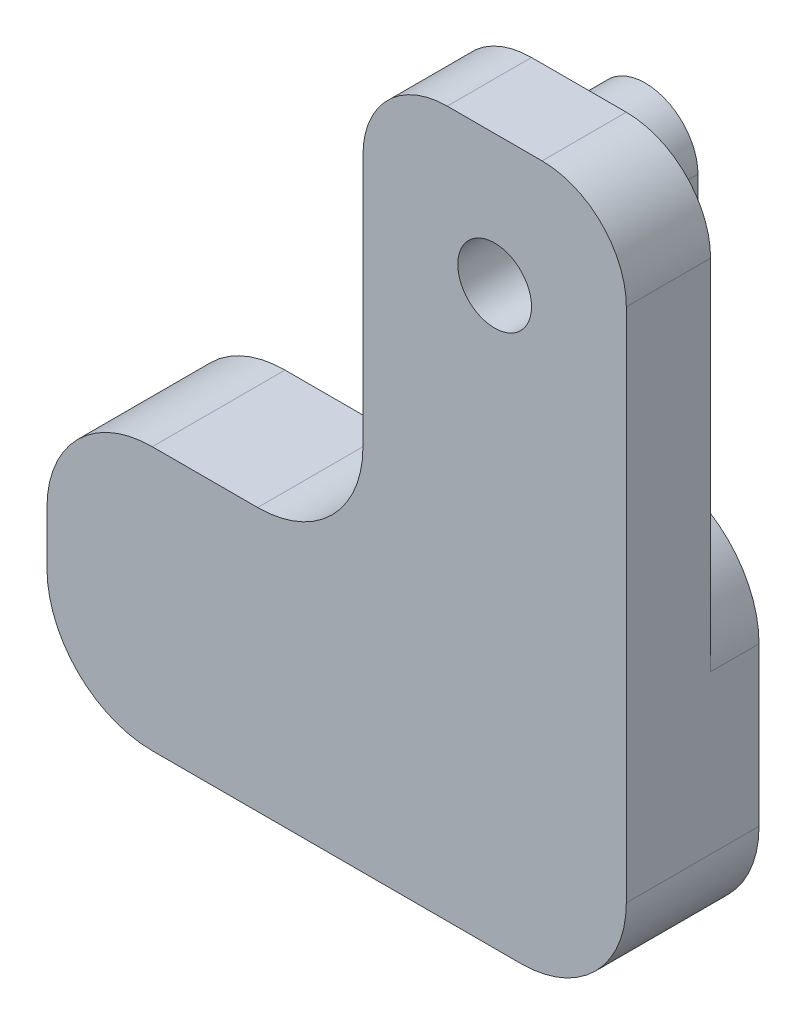
ISO-10303-21;
HEADER;
FILE_DESCRIPTION(('STEP AP214'),'2;1');
FILE_NAME('part.step','',(''),(''),'','','');
FILE_SCHEMA(('AUTOMOTIVE_DESIGN { 1 0 10303 214 1 1 1 1 }'));
ENDSEC;
DATA;
#1=APPLICATION_CONTEXT('core data for automotive mechanical design processes');
#2=APPLICATION_PROTOCOL_DEFINITION('international standard','automotive_design',2000,#1);
#3=PRODUCT_CONTEXT('',#1,'mechanical');
#4=PRODUCT('Part','Part','',(#3));
#5=PRODUCT_RELATED_PRODUCT_CATEGORY('part','',(#4));
#6=PRODUCT_DEFINITION_FORMATION('','',#4);
#7=PRODUCT_DEFINITION_CONTEXT('part definition',#1,'design');
#8=PRODUCT_DEFINITION('design','',#6,#7);
#9=PRODUCT_DEFINITION_SHAPE('','',#8);
#10=(LENGTH_UNIT() NAMED_UNIT(*) SI_UNIT(.MILLI.,.METRE.));
#11=(NAMED_UNIT(*) PLANE_ANGLE_UNIT() SI_UNIT($,.RADIAN.));
#12=(NAMED_UNIT(*) SI_UNIT($,.STERADIAN.) SOLID_ANGLE_UNIT());
#13=UNCERTAINTY_MEASURE_WITH_UNIT(LENGTH_MEASURE(1.E-05),#10,'distance_accuracy_value','');
#14=(GEOMETRIC_REPRESENTATION_CONTEXT(3) GLOBAL_UNCERTAINTY_ASSIGNED_CONTEXT((#13)) GLOBAL_UNIT_ASSIGNED_CONTEXT((#10,
#11,#12)) REPRESENTATION_CONTEXT('',''));
#15=CARTESIAN_POINT('',(0.,0.,0.));
#16=DIRECTION('',(0.,0.,1.));
#17=DIRECTION('',(1.,0.,0.));
#18=AXIS2_PLACEMENT_3D('',#15,#16,#17);
#19=CARTESIAN_POINT('',(-4.5,4.5,6.3));
#20=DIRECTION('',(0.,0.,1.));
#21=DIRECTION('',(1.,0.,0.));
#22=AXIS2_PLACEMENT_3D('',#19,#20,#21);
#23=PLANE('',#22);
#24=DIRECTION('',(0.,-1.,0.));
#25=VECTOR('',#24,1.);
#26=CARTESIAN_POINT('',(5.,4.5,6.3));
#27=LINE('',#26,#25);
#28=CARTESIAN_POINT('',(5.,4.5,6.3));
#29=VERTEX_POINT('',#28);
#30=CARTESIAN_POINT('',(5.,-4.5,6.3));
#31=VERTEX_POINT('',#30);
#32=EDGE_CURVE('E335',#29,#31,#27,.T.);
#33=ORIENTED_EDGE('',*,*,#32,.F.);
#34=CARTESIAN_POINT('',(0.,4.5,6.3));
#35=DIRECTION('',(0.,0.,1.));
#36=DIRECTION('',(1.,0.,0.));
#37=AXIS2_PLACEMENT_3D('',#34,#35,#36);
#38=CIRCLE('',#37,5.);
#39=CARTESIAN_POINT('',(-5.,4.5,6.3));
#40=VERTEX_POINT('',#39);
#41=EDGE_CURVE('E325',#29,#40,#38,.T.);
#42=ORIENTED_EDGE('',*,*,#41,.T.);
#43=DIRECTION('',(0.,-1.,0.));
#44=VECTOR('',#43,1.);
#45=CARTESIAN_POINT('',(-5.,4.5,6.3));
#46=LINE('',#45,#44);
#47=CARTESIAN_POINT('',(-5.,-4.5,6.3));
#48=VERTEX_POINT('',#47);
#49=EDGE_CURVE('E328',#40,#48,#46,.T.);
#50=ORIENTED_EDGE('',*,*,#49,.T.);
#51=CARTESIAN_POINT('',(0.,-4.5,6.3));
#52=DIRECTION('',(0.,0.,1.));
#53=DIRECTION('',(1.,0.,0.));
#54=AXIS2_PLACEMENT_3D('',#51,#52,#53);
#55=CIRCLE('',#54,5.);
#56=EDGE_CURVE('E332',#48,#31,#55,.T.);
#57=ORIENTED_EDGE('',*,*,#56,.T.);
#58=EDGE_LOOP('',(#33,#42,#50,#57));
#59=FACE_BOUND('',#58,.T.);
#60=CARTESIAN_POINT('',(-5.17949192431123,-29.5,6.3));
#61=DIRECTION('',(0.,0.,-1.));
#62=DIRECTION('',(1.,0.,0.));
#63=AXIS2_PLACEMENT_3D('',#60,#61,#62);
#64=CIRCLE('',#63,10.);
#65=CARTESIAN_POINT('',(-13.8397459621556,-24.5,6.3));
#66=VERTEX_POINT('',#65);
#67=CARTESIAN_POINT('',(-5.17949192431123,-19.5,6.3));
#68=VERTEX_POINT('',#67);
#69=EDGE_CURVE('E235',#66,#68,#64,.T.);
#70=ORIENTED_EDGE('',*,*,#69,.F.);
#71=CARTESIAN_POINT('',(-22.5,-19.5,6.3));
#72=DIRECTION('',(0.,0.,1.));
#73=DIRECTION('',(1.,0.,0.));
#74=AXIS2_PLACEMENT_3D('',#71,#72,#73);
#75=CIRCLE('',#74,10.);
#76=CARTESIAN_POINT('',(-12.5,-19.5,6.3));
#77=VERTEX_POINT('',#76);
#78=EDGE_CURVE('E11',#66,#77,#75,.T.);
#79=ORIENTED_EDGE('',*,*,#78,.T.);
#80=DIRECTION('',(0.,-1.,0.));
#81=VECTOR('',#80,1.);
#82=CARTESIAN_POINT('',(-12.5,4.5,6.3));
#83=LINE('',#82,#81);
#84=CARTESIAN_POINT('',(-12.5,4.5,6.3));
#85=VERTEX_POINT('',#84);
#86=EDGE_CURVE('E297',#85,#77,#83,.T.);
#87=ORIENTED_EDGE('',*,*,#86,.F.);
#88=CARTESIAN_POINT('',(-4.5,4.5,6.3));
#89=DIRECTION('',(0.,0.,1.));
#90=DIRECTION('',(1.,0.,0.));
#91=AXIS2_PLACEMENT_3D('',#88,#89,#90);
#92=CIRCLE('',#91,8.);
#93=CARTESIAN_POINT('',(-4.5,12.5,6.3));
#94=VERTEX_POINT('',#93);
#95=EDGE_CURVE('E271',#94,#85,#92,.T.);
#96=ORIENTED_EDGE('',*,*,#95,.F.);
#97=DIRECTION('',(-1.,0.,0.));
#98=VECTOR('',#97,1.);
#99=CARTESIAN_POINT('',(-4.5,12.5,6.3));
#100=LINE('',#99,#98);
#101=CARTESIAN_POINT('',(4.5,12.5,6.3));
#102=VERTEX_POINT('',#101);
#103=EDGE_CURVE('E280',#102,#94,#100,.T.);
#104=ORIENTED_EDGE('',*,*,#103,.F.);
#105=CARTESIAN_POINT('',(4.5,4.5,6.3));
#106=DIRECTION('',(0.,0.,1.));
#107=DIRECTION('',(-1.,0.,0.));
#108=AXIS2_PLACEMENT_3D('',#105,#106,#107);
#109=CIRCLE('',#108,8.);
#110=CARTESIAN_POINT('',(12.5,4.5,6.3));
#111=VERTEX_POINT('',#110);
#112=EDGE_CURVE('E304',#111,#102,#109,.T.);
#113=ORIENTED_EDGE('',*,*,#112,.F.);
#114=DIRECTION('',(0.,1.,0.));
#115=VECTOR('',#114,1.);
#116=CARTESIAN_POINT('',(12.5,4.5,6.3));
#117=LINE('',#116,#115);
#118=CARTESIAN_POINT('',(12.5,-29.5000000000001,6.3));
#119=VERTEX_POINT('',#118);
#120=EDGE_CURVE('E301',#119,#111,#117,.T.);
#121=ORIENTED_EDGE('',*,*,#120,.F.);
#122=CARTESIAN_POINT('',(2.50000000000001,-29.5,6.3));
#123=DIRECTION('',(0.,0.,-1.));
#124=DIRECTION('',(-1.,0.,0.));
#125=AXIS2_PLACEMENT_3D('',#122,#123,#124);
#126=CIRCLE('',#125,10.);
#127=CARTESIAN_POINT('',(2.49999999999994,-19.5,6.3));
#128=VERTEX_POINT('',#127);
#129=EDGE_CURVE('E59',#128,#119,#126,.T.);
#130=ORIENTED_EDGE('',*,*,#129,.F.);
#131=DIRECTION('',(1.,0.,0.));
#132=VECTOR('',#131,1.);
#133=CARTESIAN_POINT('',(2.49999999999994,-19.5,6.3));
#134=LINE('',#133,#132);
#135=EDGE_CURVE('E54',#68,#128,#134,.T.);
#136=ORIENTED_EDGE('',*,*,#135,.F.);
#137=EDGE_LOOP('',(#70,#79,#87,#96,#104,#113,#121,#130,#136));
#138=FACE_BOUND('',#137,.T.);
#139=ADVANCED_FACE('F38',(#59,#138),#23,.F.);
#140=CARTESIAN_POINT('',(0.,4.5,6.3));
#141=DIRECTION('',(0.,0.,-1.));
#142=DIRECTION('',(-1.,0.,0.));
#143=AXIS2_PLACEMENT_3D('',#140,#141,#142);
#144=CYLINDRICAL_SURFACE('',#143,5.);
#145=CARTESIAN_POINT('',(0.,4.5,0.));
#146=DIRECTION('',(0.,0.,1.));
#147=DIRECTION('',(1.,0.,0.));
#148=AXIS2_PLACEMENT_3D('',#145,#146,#147);
#149=CIRCLE('',#148,5.);
#150=CARTESIAN_POINT('',(5.,4.5,0.));
#151=VERTEX_POINT('',#150);
#152=CARTESIAN_POINT('',(-5.,4.5,0.));
#153=VERTEX_POINT('',#152);
#154=EDGE_CURVE('E324',#151,#153,#149,.T.);
#155=ORIENTED_EDGE('',*,*,#154,.T.);
#156=DIRECTION('',(0.,0.,-1.));
#157=VECTOR('',#156,1.);
#158=CARTESIAN_POINT('',(-5.,4.5,6.3));
#159=LINE('',#158,#157);
#160=EDGE_CURVE('E362',#40,#153,#159,.T.);
#161=ORIENTED_EDGE('',*,*,#160,.F.);
#162=ORIENTED_EDGE('',*,*,#41,.F.);
#163=DIRECTION('',(0.,0.,-1.));
#164=VECTOR('',#163,1.);
#165=CARTESIAN_POINT('',(5.,4.5,6.3));
#166=LINE('',#165,#164);
#167=EDGE_CURVE('E339',#29,#151,#166,.T.);
#168=ORIENTED_EDGE('',*,*,#167,.T.);
#169=EDGE_LOOP('',(#155,#161,#162,#168));
#170=FACE_BOUND('',#169,.T.);
#171=ADVANCED_FACE('F460',(#170),#144,.T.);
#172=CARTESIAN_POINT('',(-5.,4.5,6.3));
#173=DIRECTION('',(1.,0.,0.));
#174=DIRECTION('',(0.,0.,-1.));
#175=AXIS2_PLACEMENT_3D('',#172,#173,#174);
#176=PLANE('',#175);
#177=DIRECTION('',(0.,-1.,0.));
#178=VECTOR('',#177,1.);
#179=CARTESIAN_POINT('',(-5.,4.5,0.));
#180=LINE('',#179,#178);
#181=CARTESIAN_POINT('',(-5.,-4.5,0.));
#182=VERTEX_POINT('',#181);
#183=EDGE_CURVE('E343',#153,#182,#180,.T.);
#184=ORIENTED_EDGE('',*,*,#183,.T.);
#185=DIRECTION('',(0.,0.,-1.));
#186=VECTOR('',#185,1.);
#187=CARTESIAN_POINT('',(-5.,-4.5,6.3));
#188=LINE('',#187,#186);
#189=EDGE_CURVE('E358',#48,#182,#188,.T.);
#190=ORIENTED_EDGE('',*,*,#189,.F.);
#191=ORIENTED_EDGE('',*,*,#49,.F.);
#192=ORIENTED_EDGE('',*,*,#160,.T.);
#193=EDGE_LOOP('',(#184,#190,#191,#192));
#194=FACE_BOUND('',#193,.T.);
#195=ADVANCED_FACE('F466',(#194),#176,.F.);
#196=CARTESIAN_POINT('',(0.,-4.5,6.3));
#197=DIRECTION('',(0.,0.,-1.));
#198=DIRECTION('',(-1.,0.,0.));
#199=AXIS2_PLACEMENT_3D('',#196,#197,#198);
#200=CYLINDRICAL_SURFACE('',#199,5.);
#201=CARTESIAN_POINT('',(0.,-4.5,0.));
#202=DIRECTION('',(0.,0.,1.));
#203=DIRECTION('',(1.,0.,0.));
#204=AXIS2_PLACEMENT_3D('',#201,#202,#203);
#205=CIRCLE('',#204,5.);
#206=CARTESIAN_POINT('',(5.,-4.5,0.));
#207=VERTEX_POINT('',#206);
#208=EDGE_CURVE('E346',#182,#207,#205,.T.);
#209=ORIENTED_EDGE('',*,*,#208,.T.);
#210=DIRECTION('',(0.,0.,-1.));
#211=VECTOR('',#210,1.);
#212=CARTESIAN_POINT('',(5.,-4.5,6.3));
#213=LINE('',#212,#211);
#214=EDGE_CURVE('E355',#31,#207,#213,.T.);
#215=ORIENTED_EDGE('',*,*,#214,.F.);
#216=ORIENTED_EDGE('',*,*,#56,.F.);
#217=ORIENTED_EDGE('',*,*,#189,.T.);
#218=EDGE_LOOP('',(#209,#215,#216,#217));
#219=FACE_BOUND('',#218,.T.);
#220=ADVANCED_FACE('F489',(#219),#200,.T.);
#221=CARTESIAN_POINT('',(5.,4.5,6.3));
#222=DIRECTION('',(1.,0.,0.));
#223=DIRECTION('',(0.,0.,-1.));
#224=AXIS2_PLACEMENT_3D('',#221,#222,#223);
#225=PLANE('',#224);
#226=DIRECTION('',(0.,-1.,0.));
#227=VECTOR('',#226,1.);
#228=CARTESIAN_POINT('',(5.,4.5,0.));
#229=LINE('',#228,#227);
#230=EDGE_CURVE('E329',#151,#207,#229,.T.);
#231=ORIENTED_EDGE('',*,*,#230,.F.);
#232=ORIENTED_EDGE('',*,*,#167,.F.);
#233=ORIENTED_EDGE('',*,*,#32,.T.);
#234=ORIENTED_EDGE('',*,*,#214,.T.);
#235=EDGE_LOOP('',(#231,#232,#233,#234));
#236=FACE_BOUND('',#235,.T.);
#237=ADVANCED_FACE('F485',(#236),#225,.T.);
#238=CARTESIAN_POINT('',(0.,4.5,0.));
#239=DIRECTION('',(0.,0.,1.));
#240=DIRECTION('',(1.,0.,0.));
#241=AXIS2_PLACEMENT_3D('',#238,#239,#240);
#242=PLANE('',#241);
#243=ORIENTED_EDGE('',*,*,#154,.F.);
#244=ORIENTED_EDGE('',*,*,#230,.T.);
#245=ORIENTED_EDGE('',*,*,#208,.F.);
#246=ORIENTED_EDGE('',*,*,#183,.F.);
#247=EDGE_LOOP('',(#243,#244,#245,#246));
#248=FACE_BOUND('',#247,.T.);
#249=ADVANCED_FACE('F482',(#248),#242,.F.);
#250=CARTESIAN_POINT('',(-4.5,4.5,14.3));
#251=DIRECTION('',(0.,0.,-1.));
#252=DIRECTION('',(-1.,0.,0.));
#253=AXIS2_PLACEMENT_3D('',#250,#251,#252);
#254=CYLINDRICAL_SURFACE('',#253,8.);
#255=ORIENTED_EDGE('',*,*,#95,.T.);
#256=DIRECTION('',(0.,0.,-1.));
#257=VECTOR('',#256,1.);
#258=CARTESIAN_POINT('',(-12.5,4.5,14.3));
#259=LINE('',#258,#257);
#260=CARTESIAN_POINT('',(-12.5,4.5,14.3));
#261=VERTEX_POINT('',#260);
#262=EDGE_CURVE('E320',#261,#85,#259,.T.);
#263=ORIENTED_EDGE('',*,*,#262,.F.);
#264=CARTESIAN_POINT('',(-4.5,4.5,14.3));
#265=DIRECTION('',(0.,0.,1.));
#266=DIRECTION('',(1.,0.,0.));
#267=AXIS2_PLACEMENT_3D('',#264,#265,#266);
#268=CIRCLE('',#267,8.);
#269=CARTESIAN_POINT('',(-4.5,12.5,14.3));
#270=VERTEX_POINT('',#269);
#271=EDGE_CURVE('E275',#270,#261,#268,.T.);
#272=ORIENTED_EDGE('',*,*,#271,.F.);
#273=DIRECTION('',(0.,0.,-1.));
#274=VECTOR('',#273,1.);
#275=CARTESIAN_POINT('',(-4.5,12.5,14.3));
#276=LINE('',#275,#274);
#277=EDGE_CURVE('E293',#270,#94,#276,.T.);
#278=ORIENTED_EDGE('',*,*,#277,.T.);
#279=EDGE_LOOP('',(#255,#263,#272,#278));
#280=FACE_BOUND('',#279,.T.);
#281=ADVANCED_FACE('F438',(#280),#254,.T.);
#282=CARTESIAN_POINT('',(-12.5,4.5,14.3));
#283=DIRECTION('',(1.,0.,0.));
#284=DIRECTION('',(0.,0.,-1.));
#285=AXIS2_PLACEMENT_3D('',#282,#283,#284);
#286=PLANE('',#285);
#287=ORIENTED_EDGE('',*,*,#86,.T.);
#288=DIRECTION('',(0.,0.,1.));
#289=VECTOR('',#288,1.);
#290=CARTESIAN_POINT('',(-12.5,-19.5,14.3));
#291=LINE('',#290,#289);
#292=CARTESIAN_POINT('',(-12.5,-19.5,14.3));
#293=VERTEX_POINT('',#292);
#294=EDGE_CURVE('E385',#77,#293,#291,.T.);
#295=ORIENTED_EDGE('',*,*,#294,.T.);
#296=DIRECTION('',(0.,-1.,0.));
#297=VECTOR('',#296,1.);
#298=CARTESIAN_POINT('',(-12.5,4.5,14.3));
#299=LINE('',#298,#297);
#300=EDGE_CURVE('E279',#261,#293,#299,.T.);
#301=ORIENTED_EDGE('',*,*,#300,.F.);
#302=ORIENTED_EDGE('',*,*,#262,.T.);
#303=EDGE_LOOP('',(#287,#295,#301,#302));
#304=FACE_BOUND('',#303,.T.);
#305=ADVANCED_FACE('F440',(#304),#286,.F.);
#306=CARTESIAN_POINT('',(12.5,4.5,14.3));
#307=DIRECTION('',(-1.,0.,0.));
#308=DIRECTION('',(0.,-1.,0.));
#309=AXIS2_PLACEMENT_3D('',#306,#307,#308);
#310=PLANE('',#309);
#311=DIRECTION('',(0.,1.,0.));
#312=VECTOR('',#311,1.);
#313=CARTESIAN_POINT('',(12.5,4.5,14.3));
#314=LINE('',#313,#312);
#315=CARTESIAN_POINT('',(12.5,-44.5,14.3));
#316=VERTEX_POINT('',#315);
#317=CARTESIAN_POINT('',(12.5,4.5,14.3));
#318=VERTEX_POINT('',#317);
#319=EDGE_CURVE('E284',#316,#318,#314,.T.);
#320=ORIENTED_EDGE('',*,*,#319,.F.);
#321=DIRECTION('',(0.,0.,1.));
#322=VECTOR('',#321,1.);
#323=CARTESIAN_POINT('',(12.5,-44.5,6.3));
#324=LINE('',#323,#322);
#325=CARTESIAN_POINT('',(12.5,-44.5,1.7));
#326=VERTEX_POINT('',#325);
#327=EDGE_CURVE('E375',#316,#326,#324,.F.);
#328=ORIENTED_EDGE('',*,*,#327,.T.);
#329=DIRECTION('',(0.,-1.,0.));
#330=VECTOR('',#329,1.);
#331=CARTESIAN_POINT('',(12.5,-29.5000000000001,1.7));
#332=LINE('',#331,#330);
#333=CARTESIAN_POINT('',(12.5,-29.5000000000001,1.7));
#334=VERTEX_POINT('',#333);
#335=EDGE_CURVE('E200',#334,#326,#332,.T.);
#336=ORIENTED_EDGE('',*,*,#335,.F.);
#337=DIRECTION('',(0.,0.,1.));
#338=VECTOR('',#337,1.);
#339=CARTESIAN_POINT('',(12.5,-29.5000000000001,1.7));
#340=LINE('',#339,#338);
#341=EDGE_CURVE('E234',#334,#119,#340,.T.);
#342=ORIENTED_EDGE('',*,*,#341,.T.);
#343=ORIENTED_EDGE('',*,*,#120,.T.);
#344=DIRECTION('',(0.,0.,-1.));
#345=VECTOR('',#344,1.);
#346=CARTESIAN_POINT('',(12.5,4.5,14.3));
#347=LINE('',#346,#345);
#348=EDGE_CURVE('E316',#318,#111,#347,.T.);
#349=ORIENTED_EDGE('',*,*,#348,.F.);
#350=EDGE_LOOP('',(#320,#328,#336,#342,#343,#349));
#351=FACE_BOUND('',#350,.T.);
#352=ADVANCED_FACE('F423',(#351),#310,.F.);
#353=CARTESIAN_POINT('',(4.5,4.5,14.3));
#354=DIRECTION('',(0.,0.,-1.));
#355=DIRECTION('',(-1.,0.,0.));
#356=AXIS2_PLACEMENT_3D('',#353,#354,#355);
#357=CYLINDRICAL_SURFACE('',#356,8.);
#358=ORIENTED_EDGE('',*,*,#112,.T.);
#359=DIRECTION('',(0.,0.,-1.));
#360=VECTOR('',#359,1.);
#361=CARTESIAN_POINT('',(4.5,12.5,14.3));
#362=LINE('',#361,#360);
#363=CARTESIAN_POINT('',(4.5,12.5,14.3));
#364=VERTEX_POINT('',#363);
#365=EDGE_CURVE('E312',#364,#102,#362,.T.);
#366=ORIENTED_EDGE('',*,*,#365,.F.);
#367=CARTESIAN_POINT('',(4.5,4.5,14.3));
#368=DIRECTION('',(0.,0.,1.));
#369=DIRECTION('',(-1.,0.,0.));
#370=AXIS2_PLACEMENT_3D('',#367,#368,#369);
#371=CIRCLE('',#370,8.);
#372=EDGE_CURVE('E287',#318,#364,#371,.T.);
#373=ORIENTED_EDGE('',*,*,#372,.F.);
#374=ORIENTED_EDGE('',*,*,#348,.T.);
#375=EDGE_LOOP('',(#358,#366,#373,#374));
#376=FACE_BOUND('',#375,.T.);
#377=ADVANCED_FACE('F428',(#376),#357,.T.);
#378=CARTESIAN_POINT('',(-4.5,12.5,14.3));
#379=DIRECTION('',(0.,-1.,0.));
#380=DIRECTION('',(0.,0.,-1.));
#381=AXIS2_PLACEMENT_3D('',#378,#379,#380);
#382=PLANE('',#381);
#383=ORIENTED_EDGE('',*,*,#103,.T.);
#384=ORIENTED_EDGE('',*,*,#277,.F.);
#385=DIRECTION('',(-1.,0.,0.));
#386=VECTOR('',#385,1.);
#387=CARTESIAN_POINT('',(-4.5,12.5,14.3));
#388=LINE('',#387,#386);
#389=EDGE_CURVE('E290',#364,#270,#388,.T.);
#390=ORIENTED_EDGE('',*,*,#389,.F.);
#391=ORIENTED_EDGE('',*,*,#365,.T.);
#392=EDGE_LOOP('',(#383,#384,#390,#391));
#393=FACE_BOUND('',#392,.T.);
#394=ADVANCED_FACE('F434',(#393),#382,.F.);
#395=CARTESIAN_POINT('',(-4.5,4.5,14.3));
#396=DIRECTION('',(0.,0.,1.));
#397=DIRECTION('',(1.,0.,0.));
#398=AXIS2_PLACEMENT_3D('',#395,#396,#397);
#399=PLANE('',#398);
#400=CARTESIAN_POINT('',(0.,0.,14.3));
#401=DIRECTION('',(0.,0.,1.));
#402=DIRECTION('',(1.,0.,0.));
#403=AXIS2_PLACEMENT_3D('',#400,#401,#402);
#404=CIRCLE('',#403,3.5);
#405=CARTESIAN_POINT('',(3.5,0.,14.3));
#406=VERTEX_POINT('',#405);
#407=EDGE_CURVE('E266',#406,#406,#404,.T.);
#408=ORIENTED_EDGE('',*,*,#407,.F.);
#409=EDGE_LOOP('',(#408));
#410=FACE_BOUND('',#409,.T.);
#411=DIRECTION('',(1.,0.,0.));
#412=VECTOR('',#411,1.);
#413=CARTESIAN_POINT('',(-12.5,-54.5,14.3));
#414=LINE('',#413,#412);
#415=CARTESIAN_POINT('',(-32.5,-54.5,14.3));
#416=VERTEX_POINT('',#415);
#417=CARTESIAN_POINT('',(2.50000000000002,-54.5,14.3));
#418=VERTEX_POINT('',#417);
#419=EDGE_CURVE('E263',#416,#418,#414,.T.);
#420=ORIENTED_EDGE('',*,*,#419,.T.);
#421=CARTESIAN_POINT('',(2.50000000000002,-44.5,14.3));
#422=DIRECTION('',(0.,0.,1.));
#423=DIRECTION('',(1.,0.,0.));
#424=AXIS2_PLACEMENT_3D('',#421,#422,#423);
#425=CIRCLE('',#424,10.);
#426=EDGE_CURVE('E179',#418,#316,#425,.T.);
#427=ORIENTED_EDGE('',*,*,#426,.T.);
#428=ORIENTED_EDGE('',*,*,#319,.T.);
#429=ORIENTED_EDGE('',*,*,#372,.T.);
#430=ORIENTED_EDGE('',*,*,#389,.T.);
#431=ORIENTED_EDGE('',*,*,#271,.T.);
#432=ORIENTED_EDGE('',*,*,#300,.T.);
#433=CARTESIAN_POINT('',(-22.5,-19.5,14.3));
#434=DIRECTION('',(0.,0.,1.));
#435=DIRECTION('',(1.,0.,0.));
#436=AXIS2_PLACEMENT_3D('',#433,#434,#435);
#437=CIRCLE('',#436,10.);
#438=CARTESIAN_POINT('',(-22.5,-29.5,14.3));
#439=VERTEX_POINT('',#438);
#440=EDGE_CURVE('E47',#293,#439,#437,.F.);
#441=ORIENTED_EDGE('',*,*,#440,.T.);
#442=DIRECTION('',(-1.,0.,0.));
#443=VECTOR('',#442,1.);
#444=CARTESIAN_POINT('',(-42.5,-29.5,14.3));
#445=LINE('',#444,#443);
#446=CARTESIAN_POINT('',(-32.5,-29.5,14.3));
#447=VERTEX_POINT('',#446);
#448=EDGE_CURVE('E255',#439,#447,#445,.T.);
#449=ORIENTED_EDGE('',*,*,#448,.T.);
#450=CARTESIAN_POINT('',(-32.5,-39.5,14.3));
#451=DIRECTION('',(0.,0.,1.));
#452=DIRECTION('',(1.,0.,0.));
#453=AXIS2_PLACEMENT_3D('',#450,#451,#452);
#454=CIRCLE('',#453,10.);
#455=CARTESIAN_POINT('',(-42.5,-39.5,14.3));
#456=VERTEX_POINT('',#455);
#457=EDGE_CURVE('E184',#447,#456,#454,.T.);
#458=ORIENTED_EDGE('',*,*,#457,.T.);
#459=DIRECTION('',(0.,-1.,0.));
#460=VECTOR('',#459,1.);
#461=CARTESIAN_POINT('',(-42.5,-54.5,14.3));
#462=LINE('',#461,#460);
#463=CARTESIAN_POINT('',(-42.5,-44.5,14.3));
#464=VERTEX_POINT('',#463);
#465=EDGE_CURVE('E259',#456,#464,#462,.T.);
#466=ORIENTED_EDGE('',*,*,#465,.T.);
#467=CARTESIAN_POINT('',(-32.5,-44.5,14.3));
#468=DIRECTION('',(0.,0.,1.));
#469=DIRECTION('',(1.,0.,0.));
#470=AXIS2_PLACEMENT_3D('',#467,#468,#469);
#471=CIRCLE('',#470,10.);
#472=EDGE_CURVE('E370',#464,#416,#471,.T.);
#473=ORIENTED_EDGE('',*,*,#472,.T.);
#474=EDGE_LOOP('',(#420,#427,#428,#429,#430,#431,#432,#441,#449,#458,#466,#473));
#475=FACE_BOUND('',#474,.T.);
#476=ADVANCED_FACE('F398',(#410,#475),#399,.T.);
#477=CARTESIAN_POINT('',(0.,0.,6.3));
#478=DIRECTION('',(0.,0.,1.));
#479=DIRECTION('',(1.,0.,0.));
#480=AXIS2_PLACEMENT_3D('',#477,#478,#479);
#481=CYLINDRICAL_SURFACE('',#480,3.5);
#482=CARTESIAN_POINT('',(0.,0.,6.3));
#483=DIRECTION('',(0.,0.,1.));
#484=DIRECTION('',(1.,0.,0.));
#485=AXIS2_PLACEMENT_3D('',#482,#483,#484);
#486=CIRCLE('',#485,3.5);
#487=CARTESIAN_POINT('',(3.5,0.,6.3));
#488=VERTEX_POINT('',#487);
#489=EDGE_CURVE('E267',#488,#488,#486,.T.);
#490=ORIENTED_EDGE('',*,*,#489,.F.);
#491=EDGE_LOOP('',(#490));
#492=FACE_BOUND('',#491,.T.);
#493=ORIENTED_EDGE('',*,*,#407,.T.);
#494=EDGE_LOOP('',(#493));
#495=FACE_BOUND('',#494,.T.);
#496=ADVANCED_FACE('F519',(#492,#495),#481,.F.);
#497=CARTESIAN_POINT('',(0.,0.,6.3));
#498=DIRECTION('',(0.,0.,1.));
#499=DIRECTION('',(1.,0.,0.));
#500=AXIS2_PLACEMENT_3D('',#497,#498,#499);
#501=PLANE('',#500);
#502=ORIENTED_EDGE('',*,*,#489,.T.);
#503=EDGE_LOOP('',(#502));
#504=FACE_BOUND('',#503,.T.);
#505=ADVANCED_FACE('F517',(#504),#501,.T.);
#506=CARTESIAN_POINT('',(-12.5,-54.5,-49.6016994374947));
#507=DIRECTION('',(0.,-1.,0.));
#508=DIRECTION('',(0.,0.,-1.));
#509=AXIS2_PLACEMENT_3D('',#506,#507,#508);
#510=PLANE('',#509);
#511=DIRECTION('',(0.,0.,1.));
#512=VECTOR('',#511,1.);
#513=CARTESIAN_POINT('',(-32.5,-54.5,-49.6016994374947));
#514=LINE('',#513,#512);
#515=CARTESIAN_POINT('',(-32.5,-54.5,1.7));
#516=VERTEX_POINT('',#515);
#517=EDGE_CURVE('E185',#416,#516,#514,.F.);
#518=ORIENTED_EDGE('',*,*,#517,.T.);
#519=DIRECTION('',(-1.,0.,0.));
#520=VECTOR('',#519,1.);
#521=CARTESIAN_POINT('',(2.50000000000002,-54.5,1.7));
#522=LINE('',#521,#520);
#523=CARTESIAN_POINT('',(2.50000000000002,-54.5,1.7));
#524=VERTEX_POINT('',#523);
#525=EDGE_CURVE('E188',#524,#516,#522,.T.);
#526=ORIENTED_EDGE('',*,*,#525,.F.);
#527=DIRECTION('',(0.,0.,1.));
#528=VECTOR('',#527,1.);
#529=CARTESIAN_POINT('',(2.50000000000002,-54.5,14.3));
#530=LINE('',#529,#528);
#531=EDGE_CURVE('E173',#524,#418,#530,.T.);
#532=ORIENTED_EDGE('',*,*,#531,.T.);
#533=ORIENTED_EDGE('',*,*,#419,.F.);
#534=EDGE_LOOP('',(#518,#526,#532,#533));
#535=FACE_BOUND('',#534,.T.);
#536=ADVANCED_FACE('F189',(#535),#510,.T.);
#537=CARTESIAN_POINT('',(-42.5,-54.5,-32.7512483795333));
#538=DIRECTION('',(-1.,0.,0.));
#539=DIRECTION('',(0.,0.,1.));
#540=AXIS2_PLACEMENT_3D('',#537,#538,#539);
#541=PLANE('',#540);
#542=DIRECTION('',(0.,0.,1.));
#543=VECTOR('',#542,1.);
#544=CARTESIAN_POINT('',(-42.5,-39.5,-32.7512483795333));
#545=LINE('',#544,#543);
#546=CARTESIAN_POINT('',(-42.5,-39.5,1.7));
#547=VERTEX_POINT('',#546);
#548=EDGE_CURVE('E378',#456,#547,#545,.F.);
#549=ORIENTED_EDGE('',*,*,#548,.T.);
#550=DIRECTION('',(0.,1.,0.));
#551=VECTOR('',#550,1.);
#552=CARTESIAN_POINT('',(-42.5,-44.5,1.7));
#553=LINE('',#552,#551);
#554=CARTESIAN_POINT('',(-42.5,-44.5,1.7));
#555=VERTEX_POINT('',#554);
#556=EDGE_CURVE('E208',#555,#547,#553,.T.);
#557=ORIENTED_EDGE('',*,*,#556,.F.);
#558=DIRECTION('',(0.,0.,1.));
#559=VECTOR('',#558,1.);
#560=CARTESIAN_POINT('',(-42.5,-44.5,-32.7512483795333));
#561=LINE('',#560,#559);
#562=EDGE_CURVE('E381',#555,#464,#561,.T.);
#563=ORIENTED_EDGE('',*,*,#562,.T.);
#564=ORIENTED_EDGE('',*,*,#465,.F.);
#565=EDGE_LOOP('',(#549,#557,#563,#564));
#566=FACE_BOUND('',#565,.T.);
#567=ADVANCED_FACE('F417',(#566),#541,.T.);
#568=CARTESIAN_POINT('',(-42.5,-29.5,-32.7512483795333));
#569=DIRECTION('',(0.,1.,0.));
#570=DIRECTION('',(-1.,0.,0.));
#571=AXIS2_PLACEMENT_3D('',#568,#569,#570);
#572=PLANE('',#571);
#573=ORIENTED_EDGE('',*,*,#448,.F.);
#574=DIRECTION('',(0.,0.,1.));
#575=VECTOR('',#574,1.);
#576=CARTESIAN_POINT('',(-22.5,-29.5,-32.7512483795333));
#577=LINE('',#576,#575);
#578=CARTESIAN_POINT('',(-22.5,-29.5,1.7));
#579=VERTEX_POINT('',#578);
#580=EDGE_CURVE('E393',#439,#579,#577,.F.);
#581=ORIENTED_EDGE('',*,*,#580,.T.);
#582=DIRECTION('',(1.,0.,0.));
#583=VECTOR('',#582,1.);
#584=CARTESIAN_POINT('',(-32.5,-29.5,1.7));
#585=LINE('',#584,#583);
#586=CARTESIAN_POINT('',(-32.5,-29.5,1.7));
#587=VERTEX_POINT('',#586);
#588=EDGE_CURVE('E216',#587,#579,#585,.T.);
#589=ORIENTED_EDGE('',*,*,#588,.F.);
#590=DIRECTION('',(0.,0.,1.));
#591=VECTOR('',#590,1.);
#592=CARTESIAN_POINT('',(-32.5,-29.5,-32.7512483795333));
#593=LINE('',#592,#591);
#594=EDGE_CURVE('E389',#587,#447,#593,.T.);
#595=ORIENTED_EDGE('',*,*,#594,.T.);
#596=EDGE_LOOP('',(#573,#581,#589,#595));
#597=FACE_BOUND('',#596,.T.);
#598=ADVANCED_FACE('F403',(#597),#572,.T.);
#599=CARTESIAN_POINT('',(2.50000000000002,-44.5,-49.6016994374947));
#600=DIRECTION('',(0.,0.,-1.));
#601=DIRECTION('',(-1.,0.,0.));
#602=AXIS2_PLACEMENT_3D('',#599,#600,#601);
#603=CYLINDRICAL_SURFACE('',#602,10.);
#604=ORIENTED_EDGE('',*,*,#531,.F.);
#605=CARTESIAN_POINT('',(2.50000000000002,-44.5,1.7));
#606=DIRECTION('',(0.,0.,-1.));
#607=DIRECTION('',(-1.,0.,0.));
#608=AXIS2_PLACEMENT_3D('',#605,#606,#607);
#609=CIRCLE('',#608,10.);
#610=EDGE_CURVE('E178',#326,#524,#609,.T.);
#611=ORIENTED_EDGE('',*,*,#610,.F.);
#612=ORIENTED_EDGE('',*,*,#327,.F.);
#613=ORIENTED_EDGE('',*,*,#426,.F.);
#614=EDGE_LOOP('',(#604,#611,#612,#613));
#615=FACE_BOUND('',#614,.T.);
#616=ADVANCED_FACE('F175',(#615),#603,.T.);
#617=CARTESIAN_POINT('',(-32.5,-44.5,-32.7512483795333));
#618=DIRECTION('',(0.,0.,1.));
#619=DIRECTION('',(1.,0.,0.));
#620=AXIS2_PLACEMENT_3D('',#617,#618,#619);
#621=CYLINDRICAL_SURFACE('',#620,10.);
#622=ORIENTED_EDGE('',*,*,#562,.F.);
#623=CARTESIAN_POINT('',(-32.5,-44.5,1.7));
#624=DIRECTION('',(0.,0.,-1.));
#625=DIRECTION('',(-1.,0.,0.));
#626=AXIS2_PLACEMENT_3D('',#623,#624,#625);
#627=CIRCLE('',#626,10.);
#628=EDGE_CURVE('E195',#516,#555,#627,.T.);
#629=ORIENTED_EDGE('',*,*,#628,.F.);
#630=ORIENTED_EDGE('',*,*,#517,.F.);
#631=ORIENTED_EDGE('',*,*,#472,.F.);
#632=EDGE_LOOP('',(#622,#629,#630,#631));
#633=FACE_BOUND('',#632,.T.);
#634=ADVANCED_FACE('F419',(#633),#621,.T.);
#635=CARTESIAN_POINT('',(-22.5,-19.5,14.3));
#636=DIRECTION('',(0.,0.,1.));
#637=DIRECTION('',(1.,0.,0.));
#638=AXIS2_PLACEMENT_3D('',#635,#636,#637);
#639=CYLINDRICAL_SURFACE('',#638,10.);
#640=ORIENTED_EDGE('',*,*,#78,.F.);
#641=DIRECTION('',(0.,0.,1.));
#642=VECTOR('',#641,1.);
#643=CARTESIAN_POINT('',(-13.8397459621556,-24.5,1.7));
#644=LINE('',#643,#642);
#645=CARTESIAN_POINT('',(-13.8397459621556,-24.5,1.7));
#646=VERTEX_POINT('',#645);
#647=EDGE_CURVE('E251',#646,#66,#644,.T.);
#648=ORIENTED_EDGE('',*,*,#647,.F.);
#649=CARTESIAN_POINT('',(-22.5,-19.5,1.7));
#650=DIRECTION('',(0.,0.,1.));
#651=DIRECTION('',(-1.,0.,0.));
#652=AXIS2_PLACEMENT_3D('',#649,#650,#651);
#653=CIRCLE('',#652,10.);
#654=EDGE_CURVE('E220',#579,#646,#653,.T.);
#655=ORIENTED_EDGE('',*,*,#654,.F.);
#656=ORIENTED_EDGE('',*,*,#580,.F.);
#657=ORIENTED_EDGE('',*,*,#440,.F.);
#658=ORIENTED_EDGE('',*,*,#294,.F.);
#659=EDGE_LOOP('',(#640,#648,#655,#656,#657,#658));
#660=FACE_BOUND('',#659,.T.);
#661=ADVANCED_FACE('F407',(#660),#639,.F.);
#662=CARTESIAN_POINT('',(-32.5,-39.5,-32.7512483795333));
#663=DIRECTION('',(0.,0.,1.));
#664=DIRECTION('',(1.,0.,0.));
#665=AXIS2_PLACEMENT_3D('',#662,#663,#664);
#666=CYLINDRICAL_SURFACE('',#665,10.);
#667=ORIENTED_EDGE('',*,*,#594,.F.);
#668=CARTESIAN_POINT('',(-32.5,-39.5,1.7));
#669=DIRECTION('',(0.,0.,-1.));
#670=DIRECTION('',(-1.,0.,0.));
#671=AXIS2_PLACEMENT_3D('',#668,#669,#670);
#672=CIRCLE('',#671,10.);
#673=EDGE_CURVE('E212',#547,#587,#672,.T.);
#674=ORIENTED_EDGE('',*,*,#673,.F.);
#675=ORIENTED_EDGE('',*,*,#548,.F.);
#676=ORIENTED_EDGE('',*,*,#457,.F.);
#677=EDGE_LOOP('',(#667,#674,#675,#676));
#678=FACE_BOUND('',#677,.T.);
#679=ADVANCED_FACE('F40',(#678),#666,.T.);
#680=CARTESIAN_POINT('',(-5.17949192431123,-29.5,1.7));
#681=DIRECTION('',(0.,0.,1.));
#682=DIRECTION('',(1.,0.,0.));
#683=AXIS2_PLACEMENT_3D('',#680,#681,#682);
#684=CYLINDRICAL_SURFACE('',#683,10.);
#685=ORIENTED_EDGE('',*,*,#69,.T.);
#686=DIRECTION('',(0.,0.,1.));
#687=VECTOR('',#686,1.);
#688=CARTESIAN_POINT('',(-5.17949192431123,-19.5,1.7));
#689=LINE('',#688,#687);
#690=CARTESIAN_POINT('',(-5.17949192431123,-19.5,1.7));
#691=VERTEX_POINT('',#690);
#692=EDGE_CURVE('E247',#691,#68,#689,.T.);
#693=ORIENTED_EDGE('',*,*,#692,.F.);
#694=CARTESIAN_POINT('',(-5.17949192431123,-29.5,1.7));
#695=DIRECTION('',(0.,0.,-1.));
#696=DIRECTION('',(1.,0.,0.));
#697=AXIS2_PLACEMENT_3D('',#694,#695,#696);
#698=CIRCLE('',#697,10.);
#699=EDGE_CURVE('E223',#646,#691,#698,.T.);
#700=ORIENTED_EDGE('',*,*,#699,.F.);
#701=ORIENTED_EDGE('',*,*,#647,.T.);
#702=EDGE_LOOP('',(#685,#693,#700,#701));
#703=FACE_BOUND('',#702,.T.);
#704=ADVANCED_FACE('F442',(#703),#684,.T.);
#705=CARTESIAN_POINT('',(2.49999999999994,-19.5,1.7));
#706=DIRECTION('',(0.,-1.,0.));
#707=DIRECTION('',(0.,0.,-1.));
#708=AXIS2_PLACEMENT_3D('',#705,#706,#707);
#709=PLANE('',#708);
#710=ORIENTED_EDGE('',*,*,#135,.T.);
#711=DIRECTION('',(0.,0.,1.));
#712=VECTOR('',#711,1.);
#713=CARTESIAN_POINT('',(2.49999999999994,-19.5,1.7));
#714=LINE('',#713,#712);
#715=CARTESIAN_POINT('',(2.49999999999994,-19.5,1.7));
#716=VERTEX_POINT('',#715);
#717=EDGE_CURVE('E243',#716,#128,#714,.T.);
#718=ORIENTED_EDGE('',*,*,#717,.F.);
#719=DIRECTION('',(1.,0.,0.));
#720=VECTOR('',#719,1.);
#721=CARTESIAN_POINT('',(2.49999999999994,-19.5,1.7));
#722=LINE('',#721,#720);
#723=EDGE_CURVE('E226',#691,#716,#722,.T.);
#724=ORIENTED_EDGE('',*,*,#723,.F.);
#725=ORIENTED_EDGE('',*,*,#692,.T.);
#726=EDGE_LOOP('',(#710,#718,#724,#725));
#727=FACE_BOUND('',#726,.T.);
#728=ADVANCED_FACE('F446',(#727),#709,.F.);
#729=CARTESIAN_POINT('',(2.50000000000001,-29.5,1.7));
#730=DIRECTION('',(0.,0.,1.));
#731=DIRECTION('',(1.,0.,0.));
#732=AXIS2_PLACEMENT_3D('',#729,#730,#731);
#733=CYLINDRICAL_SURFACE('',#732,10.);
#734=ORIENTED_EDGE('',*,*,#129,.T.);
#735=ORIENTED_EDGE('',*,*,#341,.F.);
#736=CARTESIAN_POINT('',(2.50000000000001,-29.5,1.7));
#737=DIRECTION('',(0.,0.,-1.));
#738=DIRECTION('',(-1.,0.,0.));
#739=AXIS2_PLACEMENT_3D('',#736,#737,#738);
#740=CIRCLE('',#739,10.);
#741=EDGE_CURVE('E229',#716,#334,#740,.T.);
#742=ORIENTED_EDGE('',*,*,#741,.F.);
#743=ORIENTED_EDGE('',*,*,#717,.T.);
#744=EDGE_LOOP('',(#734,#735,#742,#743));
#745=FACE_BOUND('',#744,.T.);
#746=ADVANCED_FACE('F450',(#745),#733,.T.);
#747=CARTESIAN_POINT('',(2.50000000000002,-44.5,1.7));
#748=DIRECTION('',(0.,0.,-1.));
#749=DIRECTION('',(-1.,0.,0.));
#750=AXIS2_PLACEMENT_3D('',#747,#748,#749);
#751=PLANE('',#750);
#752=ORIENTED_EDGE('',*,*,#610,.T.);
#753=ORIENTED_EDGE('',*,*,#525,.T.);
#754=ORIENTED_EDGE('',*,*,#628,.T.);
#755=ORIENTED_EDGE('',*,*,#556,.T.);
#756=ORIENTED_EDGE('',*,*,#673,.T.);
#757=ORIENTED_EDGE('',*,*,#588,.T.);
#758=ORIENTED_EDGE('',*,*,#654,.T.);
#759=ORIENTED_EDGE('',*,*,#699,.T.);
#760=ORIENTED_EDGE('',*,*,#723,.T.);
#761=ORIENTED_EDGE('',*,*,#741,.T.);
#762=ORIENTED_EDGE('',*,*,#335,.T.);
#763=EDGE_LOOP('',(#752,#753,#754,#755,#756,#757,#758,#759,#760,#761,#762));
#764=FACE_BOUND('',#763,.T.);
#765=ADVANCED_FACE('F198',(#764),#751,.T.);
#766=CLOSED_SHELL('',(#139,#171,#195,#220,#237,#249,#281,#305,#352,#377,#394,#476,#496,#505,
#536,#567,#598,#616,#634,#661,#679,#704,#728,#746,#765));
#767=MANIFOLD_SOLID_BREP('B2',#766);
#768=ADVANCED_BREP_SHAPE_REPRESENTATION('',(#18,#767),#14);
#769=SHAPE_DEFINITION_REPRESENTATION(#9,#768);
ENDSEC;
END-ISO-10303-21;
